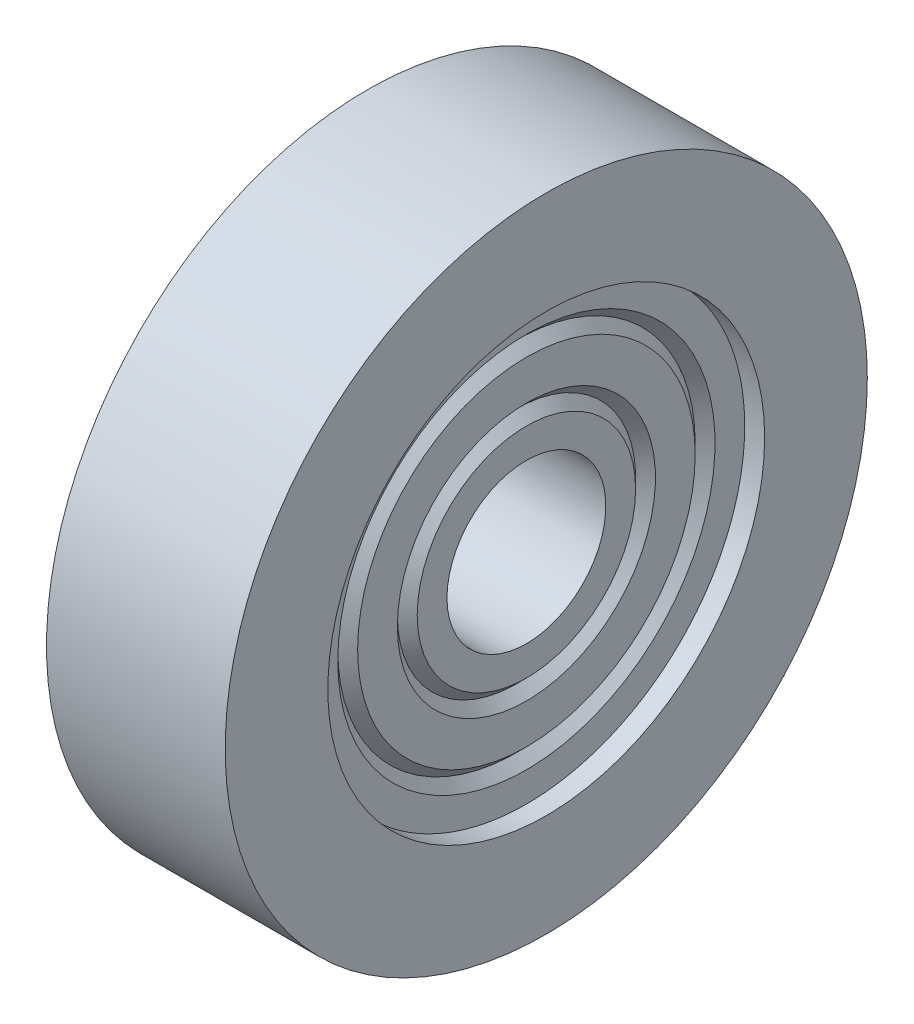
ISO-10303-21;
HEADER;
FILE_DESCRIPTION(('STEP AP214'),'2;1');
FILE_NAME('part.step','',(''),(''),'','','');
FILE_SCHEMA(('AUTOMOTIVE_DESIGN { 1 0 10303 214 1 1 1 1 }'));
ENDSEC;
DATA;
#1=APPLICATION_CONTEXT('core data for automotive mechanical design processes');
#2=APPLICATION_PROTOCOL_DEFINITION('international standard','automotive_design',2000,#1);
#3=PRODUCT_CONTEXT('',#1,'mechanical');
#4=PRODUCT('Part','Part','',(#3));
#5=PRODUCT_RELATED_PRODUCT_CATEGORY('part','',(#4));
#6=PRODUCT_DEFINITION_FORMATION('','',#4);
#7=PRODUCT_DEFINITION_CONTEXT('part definition',#1,'design');
#8=PRODUCT_DEFINITION('design','',#6,#7);
#9=PRODUCT_DEFINITION_SHAPE('','',#8);
#10=(LENGTH_UNIT() NAMED_UNIT(*) SI_UNIT(.MILLI.,.METRE.));
#11=(NAMED_UNIT(*) PLANE_ANGLE_UNIT() SI_UNIT($,.RADIAN.));
#12=(NAMED_UNIT(*) SI_UNIT($,.STERADIAN.) SOLID_ANGLE_UNIT());
#13=UNCERTAINTY_MEASURE_WITH_UNIT(LENGTH_MEASURE(1.E-05),#10,'distance_accuracy_value','');
#14=(GEOMETRIC_REPRESENTATION_CONTEXT(3) GLOBAL_UNCERTAINTY_ASSIGNED_CONTEXT((#13)) GLOBAL_UNIT_ASSIGNED_CONTEXT((#10,
#11,#12)) REPRESENTATION_CONTEXT('',''));
#15=CARTESIAN_POINT('',(0.,0.,0.));
#16=DIRECTION('',(0.,0.,1.));
#17=DIRECTION('',(1.,0.,0.));
#18=AXIS2_PLACEMENT_3D('',#15,#16,#17);
#19=CARTESIAN_POINT('',(4.5,0.,0.));
#20=DIRECTION('',(1.,0.,0.));
#21=DIRECTION('',(0.,0.,-1.));
#22=AXIS2_PLACEMENT_3D('',#19,#20,#21);
#23=PLANE('',#22);
#24=CARTESIAN_POINT('',(4.5,0.,0.));
#25=DIRECTION('',(1.,0.,0.));
#26=DIRECTION('',(0.,0.,-1.));
#27=AXIS2_PLACEMENT_3D('',#24,#25,#26);
#28=CIRCLE('',#27,16.17);
#29=CARTESIAN_POINT('',(4.5,0.,-16.17));
#30=VERTEX_POINT('',#29);
#31=EDGE_CURVE('E11',#30,#30,#28,.T.);
#32=ORIENTED_EDGE('',*,*,#31,.T.);
#33=EDGE_LOOP('',(#32));
#34=FACE_BOUND('',#33,.T.);
#35=CARTESIAN_POINT('',(4.5,0.,0.));
#36=DIRECTION('',(1.,0.,0.));
#37=DIRECTION('',(0.,0.,-1.));
#38=AXIS2_PLACEMENT_3D('',#35,#36,#37);
#39=CIRCLE('',#38,11.);
#40=CARTESIAN_POINT('',(4.5,0.,-11.));
#41=VERTEX_POINT('',#40);
#42=EDGE_CURVE('E52',#41,#41,#39,.T.);
#43=ORIENTED_EDGE('',*,*,#42,.F.);
#44=EDGE_LOOP('',(#43));
#45=FACE_BOUND('',#44,.T.);
#46=ADVANCED_FACE('F41',(#34,#45),#23,.T.);
#47=CARTESIAN_POINT('',(-4.5,0.,0.));
#48=DIRECTION('',(1.,0.,0.));
#49=DIRECTION('',(0.,0.,-1.));
#50=AXIS2_PLACEMENT_3D('',#47,#48,#49);
#51=PLANE('',#50);
#52=CARTESIAN_POINT('',(-4.5,0.,0.));
#53=DIRECTION('',(1.,0.,0.));
#54=DIRECTION('',(0.,0.,-1.));
#55=AXIS2_PLACEMENT_3D('',#52,#53,#54);
#56=CIRCLE('',#55,16.17);
#57=CARTESIAN_POINT('',(-4.5,0.,-16.17));
#58=VERTEX_POINT('',#57);
#59=EDGE_CURVE('E45',#58,#58,#56,.T.);
#60=ORIENTED_EDGE('',*,*,#59,.F.);
#61=EDGE_LOOP('',(#60));
#62=FACE_BOUND('',#61,.T.);
#63=CARTESIAN_POINT('',(-4.5,0.,0.));
#64=DIRECTION('',(1.,0.,0.));
#65=DIRECTION('',(0.,0.,-1.));
#66=AXIS2_PLACEMENT_3D('',#63,#64,#65);
#67=CIRCLE('',#66,11.);
#68=CARTESIAN_POINT('',(-4.5,0.,-11.));
#69=VERTEX_POINT('',#68);
#70=EDGE_CURVE('E54',#69,#69,#67,.T.);
#71=ORIENTED_EDGE('',*,*,#70,.T.);
#72=EDGE_LOOP('',(#71));
#73=FACE_BOUND('',#72,.T.);
#74=ADVANCED_FACE('F64',(#62,#73),#51,.F.);
#75=CARTESIAN_POINT('',(4.5,0.,0.));
#76=DIRECTION('',(-1.,0.,0.));
#77=DIRECTION('',(0.,0.,1.));
#78=AXIS2_PLACEMENT_3D('',#75,#76,#77);
#79=CYLINDRICAL_SURFACE('',#78,16.17);
#80=ORIENTED_EDGE('',*,*,#31,.F.);
#81=EDGE_LOOP('',(#80));
#82=FACE_BOUND('',#81,.T.);
#83=ORIENTED_EDGE('',*,*,#59,.T.);
#84=EDGE_LOOP('',(#83));
#85=FACE_BOUND('',#84,.T.);
#86=ADVANCED_FACE('F43',(#82,#85),#79,.T.);
#87=CARTESIAN_POINT('',(4.5,0.,0.));
#88=DIRECTION('',(-1.,0.,0.));
#89=DIRECTION('',(0.,0.,1.));
#90=AXIS2_PLACEMENT_3D('',#87,#88,#89);
#91=CYLINDRICAL_SURFACE('',#90,11.);
#92=ORIENTED_EDGE('',*,*,#42,.T.);
#93=EDGE_LOOP('',(#92));
#94=FACE_BOUND('',#93,.T.);
#95=ORIENTED_EDGE('',*,*,#70,.F.);
#96=EDGE_LOOP('',(#95));
#97=FACE_BOUND('',#96,.T.);
#98=ADVANCED_FACE('F60',(#94,#97),#91,.F.);
#99=CLOSED_SHELL('',(#46,#74,#86,#98));
#100=MANIFOLD_SOLID_BREP('B2',#99);
#101=CARTESIAN_POINT('',(-3.5,5.5,0.));
#102=DIRECTION('',(1.,0.,0.));
#103=DIRECTION('',(0.,0.,-1.));
#104=AXIS2_PLACEMENT_3D('',#101,#102,#103);
#105=PLANE('',#104);
#106=CARTESIAN_POINT('',(-3.5,0.,0.));
#107=DIRECTION('',(-1.,0.,0.));
#108=DIRECTION('',(0.,0.,1.));
#109=AXIS2_PLACEMENT_3D('',#106,#107,#108);
#110=CIRCLE('',#109,4.);
#111=CARTESIAN_POINT('',(-3.5,0.,4.));
#112=VERTEX_POINT('',#111);
#113=EDGE_CURVE('E155',#112,#112,#110,.T.);
#114=ORIENTED_EDGE('',*,*,#113,.F.);
#115=EDGE_LOOP('',(#114));
#116=FACE_BOUND('',#115,.T.);
#117=CARTESIAN_POINT('',(-3.5,0.,0.));
#118=DIRECTION('',(-1.,0.,0.));
#119=DIRECTION('',(0.,0.,1.));
#120=AXIS2_PLACEMENT_3D('',#117,#118,#119);
#121=CIRCLE('',#120,5.5);
#122=CARTESIAN_POINT('',(-3.5,0.,5.5));
#123=VERTEX_POINT('',#122);
#124=EDGE_CURVE('E40',#123,#123,#121,.T.);
#125=ORIENTED_EDGE('',*,*,#124,.T.);
#126=EDGE_LOOP('',(#125));
#127=FACE_BOUND('',#126,.T.);
#128=ADVANCED_FACE('F103',(#116,#127),#105,.F.);
#129=CARTESIAN_POINT('',(-3.,0.,0.));
#130=DIRECTION('',(1.,0.,0.));
#131=DIRECTION('',(0.,0.,-1.));
#132=AXIS2_PLACEMENT_3D('',#129,#130,#131);
#133=CONICAL_SURFACE('',#132,6.,0.785398163397452);
#134=ORIENTED_EDGE('',*,*,#124,.F.);
#135=EDGE_LOOP('',(#134));
#136=FACE_BOUND('',#135,.T.);
#137=CARTESIAN_POINT('',(-3.,0.,0.));
#138=DIRECTION('',(-1.,0.,0.));
#139=DIRECTION('',(0.,0.,1.));
#140=AXIS2_PLACEMENT_3D('',#137,#138,#139);
#141=CIRCLE('',#140,6.);
#142=CARTESIAN_POINT('',(-3.,0.,6.));
#143=VERTEX_POINT('',#142);
#144=EDGE_CURVE('E109',#143,#143,#141,.T.);
#145=ORIENTED_EDGE('',*,*,#144,.T.);
#146=EDGE_LOOP('',(#145));
#147=FACE_BOUND('',#146,.T.);
#148=ADVANCED_FACE('F162',(#136,#147),#133,.T.);
#149=CARTESIAN_POINT('',(-3.5,0.,0.));
#150=DIRECTION('',(-1.,0.,0.));
#151=DIRECTION('',(0.,0.,1.));
#152=AXIS2_PLACEMENT_3D('',#149,#150,#151);
#153=CONICAL_SURFACE('',#152,6.5,0.785398163397447);
#154=ORIENTED_EDGE('',*,*,#144,.F.);
#155=EDGE_LOOP('',(#154));
#156=FACE_BOUND('',#155,.T.);
#157=CARTESIAN_POINT('',(-3.5,0.,0.));
#158=DIRECTION('',(-1.,0.,0.));
#159=DIRECTION('',(0.,0.,1.));
#160=AXIS2_PLACEMENT_3D('',#157,#158,#159);
#161=CIRCLE('',#160,6.5);
#162=CARTESIAN_POINT('',(-3.5,0.,6.5));
#163=VERTEX_POINT('',#162);
#164=EDGE_CURVE('E113',#163,#163,#161,.T.);
#165=ORIENTED_EDGE('',*,*,#164,.T.);
#166=EDGE_LOOP('',(#165));
#167=FACE_BOUND('',#166,.T.);
#168=ADVANCED_FACE('F166',(#156,#167),#153,.F.);
#169=CARTESIAN_POINT('',(-3.5,8.5,0.));
#170=DIRECTION('',(1.,0.,0.));
#171=DIRECTION('',(0.,0.,-1.));
#172=AXIS2_PLACEMENT_3D('',#169,#170,#171);
#173=PLANE('',#172);
#174=ORIENTED_EDGE('',*,*,#164,.F.);
#175=EDGE_LOOP('',(#174));
#176=FACE_BOUND('',#175,.T.);
#177=CARTESIAN_POINT('',(-3.5,0.,0.));
#178=DIRECTION('',(-1.,0.,0.));
#179=DIRECTION('',(0.,0.,1.));
#180=AXIS2_PLACEMENT_3D('',#177,#178,#179);
#181=CIRCLE('',#180,8.5);
#182=CARTESIAN_POINT('',(-3.5,0.,8.5));
#183=VERTEX_POINT('',#182);
#184=EDGE_CURVE('E117',#183,#183,#181,.T.);
#185=ORIENTED_EDGE('',*,*,#184,.T.);
#186=EDGE_LOOP('',(#185));
#187=FACE_BOUND('',#186,.T.);
#188=ADVANCED_FACE('F171',(#176,#187),#173,.F.);
#189=CARTESIAN_POINT('',(-3.,0.,0.));
#190=DIRECTION('',(1.,0.,0.));
#191=DIRECTION('',(0.,0.,-1.));
#192=AXIS2_PLACEMENT_3D('',#189,#190,#191);
#193=CONICAL_SURFACE('',#192,9.00000000000001,0.785398163397448);
#194=ORIENTED_EDGE('',*,*,#184,.F.);
#195=EDGE_LOOP('',(#194));
#196=FACE_BOUND('',#195,.T.);
#197=CARTESIAN_POINT('',(-3.,0.,0.));
#198=DIRECTION('',(-1.,0.,0.));
#199=DIRECTION('',(0.,0.,1.));
#200=AXIS2_PLACEMENT_3D('',#197,#198,#199);
#201=CIRCLE('',#200,9.00000000000001);
#202=CARTESIAN_POINT('',(-3.,0.,9.00000000000001));
#203=VERTEX_POINT('',#202);
#204=EDGE_CURVE('E122',#203,#203,#201,.T.);
#205=ORIENTED_EDGE('',*,*,#204,.T.);
#206=EDGE_LOOP('',(#205));
#207=FACE_BOUND('',#206,.T.);
#208=ADVANCED_FACE('F177',(#196,#207),#193,.T.);
#209=CARTESIAN_POINT('',(-3.5,0.,0.));
#210=DIRECTION('',(-1.,0.,0.));
#211=DIRECTION('',(0.,0.,1.));
#212=AXIS2_PLACEMENT_3D('',#209,#210,#211);
#213=CONICAL_SURFACE('',#212,9.50000000000001,0.785398163397448);
#214=ORIENTED_EDGE('',*,*,#204,.F.);
#215=EDGE_LOOP('',(#214));
#216=FACE_BOUND('',#215,.T.);
#217=CARTESIAN_POINT('',(-3.5,0.,0.));
#218=DIRECTION('',(-1.,0.,0.));
#219=DIRECTION('',(0.,0.,1.));
#220=AXIS2_PLACEMENT_3D('',#217,#218,#219);
#221=CIRCLE('',#220,9.50000000000001);
#222=CARTESIAN_POINT('',(-3.5,0.,9.50000000000001));
#223=VERTEX_POINT('',#222);
#224=EDGE_CURVE('E125',#223,#223,#221,.T.);
#225=ORIENTED_EDGE('',*,*,#224,.T.);
#226=EDGE_LOOP('',(#225));
#227=FACE_BOUND('',#226,.T.);
#228=ADVANCED_FACE('F181',(#216,#227),#213,.F.);
#229=CARTESIAN_POINT('',(-3.5,11.,0.));
#230=DIRECTION('',(1.,0.,0.));
#231=DIRECTION('',(0.,0.,-1.));
#232=AXIS2_PLACEMENT_3D('',#229,#230,#231);
#233=PLANE('',#232);
#234=ORIENTED_EDGE('',*,*,#224,.F.);
#235=EDGE_LOOP('',(#234));
#236=FACE_BOUND('',#235,.T.);
#237=CARTESIAN_POINT('',(-3.5,0.,0.));
#238=DIRECTION('',(-1.,0.,0.));
#239=DIRECTION('',(0.,0.,1.));
#240=AXIS2_PLACEMENT_3D('',#237,#238,#239);
#241=CIRCLE('',#240,11.);
#242=CARTESIAN_POINT('',(-3.5,0.,11.));
#243=VERTEX_POINT('',#242);
#244=EDGE_CURVE('E128',#243,#243,#241,.T.);
#245=ORIENTED_EDGE('',*,*,#244,.T.);
#246=EDGE_LOOP('',(#245));
#247=FACE_BOUND('',#246,.T.);
#248=ADVANCED_FACE('F185',(#236,#247),#233,.F.);
#249=CARTESIAN_POINT('',(0.,0.,0.));
#250=DIRECTION('',(-1.,0.,0.));
#251=DIRECTION('',(0.,0.,1.));
#252=AXIS2_PLACEMENT_3D('',#249,#250,#251);
#253=CYLINDRICAL_SURFACE('',#252,11.);
#254=ORIENTED_EDGE('',*,*,#244,.F.);
#255=EDGE_LOOP('',(#254));
#256=FACE_BOUND('',#255,.T.);
#257=CARTESIAN_POINT('',(3.5,0.,0.));
#258=DIRECTION('',(-1.,0.,0.));
#259=DIRECTION('',(0.,0.,1.));
#260=AXIS2_PLACEMENT_3D('',#257,#258,#259);
#261=CIRCLE('',#260,11.);
#262=CARTESIAN_POINT('',(3.5,0.,11.));
#263=VERTEX_POINT('',#262);
#264=EDGE_CURVE('E131',#263,#263,#261,.T.);
#265=ORIENTED_EDGE('',*,*,#264,.T.);
#266=EDGE_LOOP('',(#265));
#267=FACE_BOUND('',#266,.T.);
#268=ADVANCED_FACE('F189',(#256,#267),#253,.T.);
#269=CARTESIAN_POINT('',(3.5,9.5,0.));
#270=DIRECTION('',(-1.,0.,0.));
#271=DIRECTION('',(0.,0.,1.));
#272=AXIS2_PLACEMENT_3D('',#269,#270,#271);
#273=PLANE('',#272);
#274=ORIENTED_EDGE('',*,*,#264,.F.);
#275=EDGE_LOOP('',(#274));
#276=FACE_BOUND('',#275,.T.);
#277=CARTESIAN_POINT('',(3.5,0.,0.));
#278=DIRECTION('',(-1.,0.,0.));
#279=DIRECTION('',(0.,0.,1.));
#280=AXIS2_PLACEMENT_3D('',#277,#278,#279);
#281=CIRCLE('',#280,9.5);
#282=CARTESIAN_POINT('',(3.5,0.,9.5));
#283=VERTEX_POINT('',#282);
#284=EDGE_CURVE('E134',#283,#283,#281,.T.);
#285=ORIENTED_EDGE('',*,*,#284,.T.);
#286=EDGE_LOOP('',(#285));
#287=FACE_BOUND('',#286,.T.);
#288=ADVANCED_FACE('F193',(#276,#287),#273,.F.);
#289=CARTESIAN_POINT('',(3.,0.,0.));
#290=DIRECTION('',(1.,0.,0.));
#291=DIRECTION('',(0.,0.,-1.));
#292=AXIS2_PLACEMENT_3D('',#289,#290,#291);
#293=CONICAL_SURFACE('',#292,9.,0.785398163397448);
#294=ORIENTED_EDGE('',*,*,#284,.F.);
#295=EDGE_LOOP('',(#294));
#296=FACE_BOUND('',#295,.T.);
#297=CARTESIAN_POINT('',(3.,0.,0.));
#298=DIRECTION('',(-1.,0.,0.));
#299=DIRECTION('',(0.,0.,1.));
#300=AXIS2_PLACEMENT_3D('',#297,#298,#299);
#301=CIRCLE('',#300,9.);
#302=CARTESIAN_POINT('',(3.,0.,9.));
#303=VERTEX_POINT('',#302);
#304=EDGE_CURVE('E137',#303,#303,#301,.T.);
#305=ORIENTED_EDGE('',*,*,#304,.T.);
#306=EDGE_LOOP('',(#305));
#307=FACE_BOUND('',#306,.T.);
#308=ADVANCED_FACE('F197',(#296,#307),#293,.F.);
#309=CARTESIAN_POINT('',(3.5,0.,0.));
#310=DIRECTION('',(-1.,0.,0.));
#311=DIRECTION('',(0.,0.,1.));
#312=AXIS2_PLACEMENT_3D('',#309,#310,#311);
#313=CONICAL_SURFACE('',#312,8.5,0.785398163397452);
#314=ORIENTED_EDGE('',*,*,#304,.F.);
#315=EDGE_LOOP('',(#314));
#316=FACE_BOUND('',#315,.T.);
#317=CARTESIAN_POINT('',(3.5,0.,0.));
#318=DIRECTION('',(-1.,0.,0.));
#319=DIRECTION('',(0.,0.,1.));
#320=AXIS2_PLACEMENT_3D('',#317,#318,#319);
#321=CIRCLE('',#320,8.5);
#322=CARTESIAN_POINT('',(3.5,0.,8.5));
#323=VERTEX_POINT('',#322);
#324=EDGE_CURVE('E140',#323,#323,#321,.T.);
#325=ORIENTED_EDGE('',*,*,#324,.T.);
#326=EDGE_LOOP('',(#325));
#327=FACE_BOUND('',#326,.T.);
#328=ADVANCED_FACE('F201',(#316,#327),#313,.T.);
#329=CARTESIAN_POINT('',(3.5,6.5,0.));
#330=DIRECTION('',(-1.,0.,0.));
#331=DIRECTION('',(0.,0.,1.));
#332=AXIS2_PLACEMENT_3D('',#329,#330,#331);
#333=PLANE('',#332);
#334=ORIENTED_EDGE('',*,*,#324,.F.);
#335=EDGE_LOOP('',(#334));
#336=FACE_BOUND('',#335,.T.);
#337=CARTESIAN_POINT('',(3.5,0.,0.));
#338=DIRECTION('',(-1.,0.,0.));
#339=DIRECTION('',(0.,0.,1.));
#340=AXIS2_PLACEMENT_3D('',#337,#338,#339);
#341=CIRCLE('',#340,6.5);
#342=CARTESIAN_POINT('',(3.5,0.,6.5));
#343=VERTEX_POINT('',#342);
#344=EDGE_CURVE('E143',#343,#343,#341,.T.);
#345=ORIENTED_EDGE('',*,*,#344,.T.);
#346=EDGE_LOOP('',(#345));
#347=FACE_BOUND('',#346,.T.);
#348=ADVANCED_FACE('F205',(#336,#347),#333,.F.);
#349=CARTESIAN_POINT('',(3.,0.,0.));
#350=DIRECTION('',(1.,0.,0.));
#351=DIRECTION('',(0.,0.,-1.));
#352=AXIS2_PLACEMENT_3D('',#349,#350,#351);
#353=CONICAL_SURFACE('',#352,6.,0.785398163397449);
#354=ORIENTED_EDGE('',*,*,#344,.F.);
#355=EDGE_LOOP('',(#354));
#356=FACE_BOUND('',#355,.T.);
#357=CARTESIAN_POINT('',(3.,0.,0.));
#358=DIRECTION('',(-1.,0.,0.));
#359=DIRECTION('',(0.,0.,1.));
#360=AXIS2_PLACEMENT_3D('',#357,#358,#359);
#361=CIRCLE('',#360,6.);
#362=CARTESIAN_POINT('',(3.,0.,6.));
#363=VERTEX_POINT('',#362);
#364=EDGE_CURVE('E146',#363,#363,#361,.T.);
#365=ORIENTED_EDGE('',*,*,#364,.T.);
#366=EDGE_LOOP('',(#365));
#367=FACE_BOUND('',#366,.T.);
#368=ADVANCED_FACE('F209',(#356,#367),#353,.F.);
#369=CARTESIAN_POINT('',(3.5,0.,0.));
#370=DIRECTION('',(-1.,0.,0.));
#371=DIRECTION('',(0.,0.,1.));
#372=AXIS2_PLACEMENT_3D('',#369,#370,#371);
#373=CONICAL_SURFACE('',#372,5.5,0.785398163397452);
#374=ORIENTED_EDGE('',*,*,#364,.F.);
#375=EDGE_LOOP('',(#374));
#376=FACE_BOUND('',#375,.T.);
#377=CARTESIAN_POINT('',(3.5,0.,0.));
#378=DIRECTION('',(-1.,0.,0.));
#379=DIRECTION('',(0.,0.,1.));
#380=AXIS2_PLACEMENT_3D('',#377,#378,#379);
#381=CIRCLE('',#380,5.5);
#382=CARTESIAN_POINT('',(3.5,0.,5.5));
#383=VERTEX_POINT('',#382);
#384=EDGE_CURVE('E149',#383,#383,#381,.T.);
#385=ORIENTED_EDGE('',*,*,#384,.T.);
#386=EDGE_LOOP('',(#385));
#387=FACE_BOUND('',#386,.T.);
#388=ADVANCED_FACE('F213',(#376,#387),#373,.T.);
#389=CARTESIAN_POINT('',(3.5,4.,0.));
#390=DIRECTION('',(-1.,0.,0.));
#391=DIRECTION('',(0.,0.,1.));
#392=AXIS2_PLACEMENT_3D('',#389,#390,#391);
#393=PLANE('',#392);
#394=ORIENTED_EDGE('',*,*,#384,.F.);
#395=EDGE_LOOP('',(#394));
#396=FACE_BOUND('',#395,.T.);
#397=CARTESIAN_POINT('',(3.5,0.,0.));
#398=DIRECTION('',(-1.,0.,0.));
#399=DIRECTION('',(0.,0.,1.));
#400=AXIS2_PLACEMENT_3D('',#397,#398,#399);
#401=CIRCLE('',#400,4.);
#402=CARTESIAN_POINT('',(3.5,0.,4.));
#403=VERTEX_POINT('',#402);
#404=EDGE_CURVE('E152',#403,#403,#401,.T.);
#405=ORIENTED_EDGE('',*,*,#404,.T.);
#406=EDGE_LOOP('',(#405));
#407=FACE_BOUND('',#406,.T.);
#408=ADVANCED_FACE('F217',(#396,#407),#393,.F.);
#409=CARTESIAN_POINT('',(0.,0.,0.));
#410=DIRECTION('',(-1.,0.,0.));
#411=DIRECTION('',(0.,0.,1.));
#412=AXIS2_PLACEMENT_3D('',#409,#410,#411);
#413=CYLINDRICAL_SURFACE('',#412,4.);
#414=ORIENTED_EDGE('',*,*,#404,.F.);
#415=EDGE_LOOP('',(#414));
#416=FACE_BOUND('',#415,.T.);
#417=ORIENTED_EDGE('',*,*,#113,.T.);
#418=EDGE_LOOP('',(#417));
#419=FACE_BOUND('',#418,.T.);
#420=ADVANCED_FACE('F159',(#416,#419),#413,.F.);
#421=CLOSED_SHELL('',(#128,#148,#168,#188,#208,#228,#248,#268,#288,#308,#328,#348,#368,#388,
#408,#420));
#422=MANIFOLD_SOLID_BREP('B6',#421);
#423=ADVANCED_BREP_SHAPE_REPRESENTATION('',(#18,#100,#422),#14);
#424=SHAPE_DEFINITION_REPRESENTATION(#9,#423);
ENDSEC;
END-ISO-10303-21;
